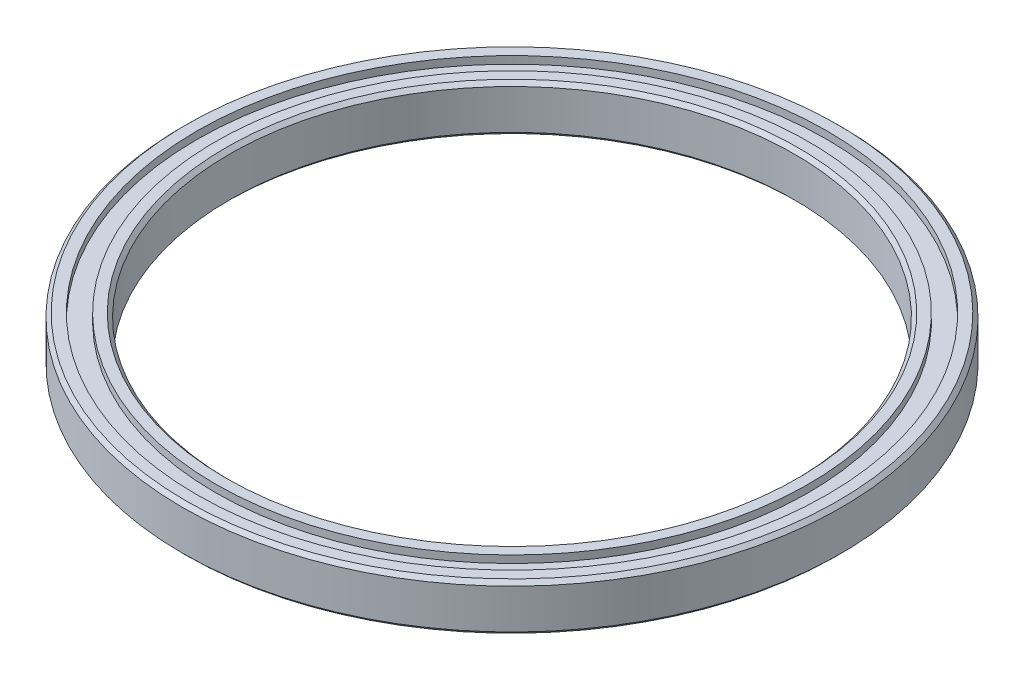
ISO-10303-21;
HEADER;
FILE_DESCRIPTION(('STEP AP214'),'2;1');
FILE_NAME('part.step','',(''),(''),'','','');
FILE_SCHEMA(('AUTOMOTIVE_DESIGN { 1 0 10303 214 1 1 1 1 }'));
ENDSEC;
DATA;
#1=APPLICATION_CONTEXT('core data for automotive mechanical design processes');
#2=APPLICATION_PROTOCOL_DEFINITION('international standard','automotive_design',2000,#1);
#3=PRODUCT_CONTEXT('',#1,'mechanical');
#4=PRODUCT('Part','Part','',(#3));
#5=PRODUCT_RELATED_PRODUCT_CATEGORY('part','',(#4));
#6=PRODUCT_DEFINITION_FORMATION('','',#4);
#7=PRODUCT_DEFINITION_CONTEXT('part definition',#1,'design');
#8=PRODUCT_DEFINITION('design','',#6,#7);
#9=PRODUCT_DEFINITION_SHAPE('','',#8);
#10=(LENGTH_UNIT() NAMED_UNIT(*) SI_UNIT(.MILLI.,.METRE.));
#11=(NAMED_UNIT(*) PLANE_ANGLE_UNIT() SI_UNIT($,.RADIAN.));
#12=(NAMED_UNIT(*) SI_UNIT($,.STERADIAN.) SOLID_ANGLE_UNIT());
#13=UNCERTAINTY_MEASURE_WITH_UNIT(LENGTH_MEASURE(1.E-05),#10,'distance_accuracy_value','');
#14=(GEOMETRIC_REPRESENTATION_CONTEXT(3) GLOBAL_UNCERTAINTY_ASSIGNED_CONTEXT((#13)) GLOBAL_UNIT_ASSIGNED_CONTEXT((#10,
#11,#12)) REPRESENTATION_CONTEXT('',''));
#15=CARTESIAN_POINT('',(0.,0.,0.));
#16=DIRECTION('',(0.,0.,1.));
#17=DIRECTION('',(1.,0.,0.));
#18=AXIS2_PLACEMENT_3D('',#15,#16,#17);
#19=CARTESIAN_POINT('',(0.,0.,0.));
#20=DIRECTION('',(0.,1.,0.));
#21=DIRECTION('',(0.,0.,1.));
#22=AXIS2_PLACEMENT_3D('',#19,#20,#21);
#23=PLANE('',#22);
#24=CARTESIAN_POINT('',(0.,0.,0.));
#25=DIRECTION('',(0.,1.,0.));
#26=DIRECTION('',(0.,0.,1.));
#27=AXIS2_PLACEMENT_3D('',#24,#25,#26);
#28=CIRCLE('',#27,38.6);
#29=CARTESIAN_POINT('',(0.,0.,38.6));
#30=VERTEX_POINT('',#29);
#31=EDGE_CURVE('E76',#30,#30,#28,.T.);
#32=ORIENTED_EDGE('',*,*,#31,.T.);
#33=EDGE_LOOP('',(#32));
#34=FACE_BOUND('',#33,.T.);
#35=CARTESIAN_POINT('',(0.,0.,0.));
#36=DIRECTION('',(0.,-1.,0.));
#37=DIRECTION('',(0.,0.,-1.));
#38=AXIS2_PLACEMENT_3D('',#35,#36,#37);
#39=CIRCLE('',#38,40.);
#40=CARTESIAN_POINT('',(0.,0.,-40.));
#41=VERTEX_POINT('',#40);
#42=EDGE_CURVE('E105',#41,#41,#39,.T.);
#43=ORIENTED_EDGE('',*,*,#42,.T.);
#44=EDGE_LOOP('',(#43));
#45=FACE_BOUND('',#44,.T.);
#46=ADVANCED_FACE('F39',(#34,#45),#23,.F.);
#47=CARTESIAN_POINT('',(0.,6.35,0.));
#48=DIRECTION('',(0.,1.,0.));
#49=DIRECTION('',(0.,0.,1.));
#50=AXIS2_PLACEMENT_3D('',#47,#48,#49);
#51=PLANE('',#50);
#52=CARTESIAN_POINT('',(0.,6.35,0.));
#53=DIRECTION('',(0.,1.,0.));
#54=DIRECTION('',(0.,0.,1.));
#55=AXIS2_PLACEMENT_3D('',#52,#53,#54);
#56=CIRCLE('',#55,38.6);
#57=CARTESIAN_POINT('',(0.,6.35,38.6));
#58=VERTEX_POINT('',#57);
#59=EDGE_CURVE('E64',#58,#58,#56,.F.);
#60=ORIENTED_EDGE('',*,*,#59,.T.);
#61=EDGE_LOOP('',(#60));
#62=FACE_BOUND('',#61,.T.);
#63=CARTESIAN_POINT('',(0.,6.35,0.));
#64=DIRECTION('',(0.,1.,0.));
#65=DIRECTION('',(0.,0.,1.));
#66=AXIS2_PLACEMENT_3D('',#63,#64,#65);
#67=CIRCLE('',#66,40.);
#68=CARTESIAN_POINT('',(0.,6.35,40.));
#69=VERTEX_POINT('',#68);
#70=EDGE_CURVE('E89',#69,#69,#67,.T.);
#71=ORIENTED_EDGE('',*,*,#70,.T.);
#72=EDGE_LOOP('',(#71));
#73=FACE_BOUND('',#72,.T.);
#74=ADVANCED_FACE('F140',(#62,#73),#51,.T.);
#75=CARTESIAN_POINT('',(0.,6.35,0.));
#76=DIRECTION('',(0.,1.,0.));
#77=DIRECTION('',(0.,0.,1.));
#78=AXIS2_PLACEMENT_3D('',#75,#76,#77);
#79=CIRCLE('',#78,43.95);
#80=CARTESIAN_POINT('',(0.,6.35,43.95));
#81=VERTEX_POINT('',#80);
#82=EDGE_CURVE('E58',#81,#81,#79,.T.);
#83=ORIENTED_EDGE('',*,*,#82,.T.);
#84=EDGE_LOOP('',(#83));
#85=FACE_BOUND('',#84,.T.);
#86=CARTESIAN_POINT('',(0.,6.35,0.));
#87=DIRECTION('',(0.,1.,0.));
#88=DIRECTION('',(0.,0.,1.));
#89=AXIS2_PLACEMENT_3D('',#86,#87,#88);
#90=CIRCLE('',#89,42.5);
#91=CARTESIAN_POINT('',(0.,6.35,42.5));
#92=VERTEX_POINT('',#91);
#93=EDGE_CURVE('E81',#92,#92,#90,.T.);
#94=ORIENTED_EDGE('',*,*,#93,.F.);
#95=EDGE_LOOP('',(#94));
#96=FACE_BOUND('',#95,.T.);
#97=ADVANCED_FACE('F132',(#85,#96),#51,.T.);
#98=CARTESIAN_POINT('',(0.,0.,0.));
#99=DIRECTION('',(0.,1.,0.));
#100=DIRECTION('',(0.,0.,1.));
#101=AXIS2_PLACEMENT_3D('',#98,#99,#100);
#102=CIRCLE('',#101,43.95);
#103=CARTESIAN_POINT('',(0.,0.,43.95));
#104=VERTEX_POINT('',#103);
#105=EDGE_CURVE('E10',#104,#104,#102,.F.);
#106=ORIENTED_EDGE('',*,*,#105,.T.);
#107=EDGE_LOOP('',(#106));
#108=FACE_BOUND('',#107,.T.);
#109=CARTESIAN_POINT('',(0.,0.,0.));
#110=DIRECTION('',(0.,-1.,0.));
#111=DIRECTION('',(0.,0.,-1.));
#112=AXIS2_PLACEMENT_3D('',#109,#110,#111);
#113=CIRCLE('',#112,42.5);
#114=CARTESIAN_POINT('',(0.,0.,-42.5));
#115=VERTEX_POINT('',#114);
#116=EDGE_CURVE('E97',#115,#115,#113,.T.);
#117=ORIENTED_EDGE('',*,*,#116,.F.);
#118=EDGE_LOOP('',(#117));
#119=FACE_BOUND('',#118,.T.);
#120=ADVANCED_FACE('F129',(#108,#119),#23,.F.);
#121=CARTESIAN_POINT('',(0.,6.35,0.));
#122=DIRECTION('',(0.,-1.,0.));
#123=DIRECTION('',(0.,0.,-1.));
#124=AXIS2_PLACEMENT_3D('',#121,#122,#123);
#125=CYLINDRICAL_SURFACE('',#124,44.45);
#126=CARTESIAN_POINT('',(0.,5.85000000000002,0.));
#127=DIRECTION('',(0.,1.,0.));
#128=DIRECTION('',(0.,0.,1.));
#129=AXIS2_PLACEMENT_3D('',#126,#127,#128);
#130=CIRCLE('',#129,44.45);
#131=CARTESIAN_POINT('',(0.,5.85000000000002,44.45));
#132=VERTEX_POINT('',#131);
#133=EDGE_CURVE('E48',#132,#132,#130,.F.);
#134=ORIENTED_EDGE('',*,*,#133,.T.);
#135=EDGE_LOOP('',(#134));
#136=FACE_BOUND('',#135,.T.);
#137=CARTESIAN_POINT('',(0.,0.500000000000007,0.));
#138=DIRECTION('',(0.,1.,0.));
#139=DIRECTION('',(0.,0.,1.));
#140=AXIS2_PLACEMENT_3D('',#137,#138,#139);
#141=CIRCLE('',#140,44.45);
#142=CARTESIAN_POINT('',(0.,0.500000000000007,44.45));
#143=VERTEX_POINT('',#142);
#144=EDGE_CURVE('E53',#143,#143,#141,.T.);
#145=ORIENTED_EDGE('',*,*,#144,.T.);
#146=EDGE_LOOP('',(#145));
#147=FACE_BOUND('',#146,.T.);
#148=ADVANCED_FACE('F131',(#136,#147),#125,.T.);
#149=CARTESIAN_POINT('',(0.,6.35,0.));
#150=DIRECTION('',(0.,-1.,0.));
#151=DIRECTION('',(0.,0.,-1.));
#152=AXIS2_PLACEMENT_3D('',#149,#150,#151);
#153=CYLINDRICAL_SURFACE('',#152,38.1);
#154=CARTESIAN_POINT('',(0.,0.499999999999987,0.));
#155=DIRECTION('',(0.,1.,0.));
#156=DIRECTION('',(0.,0.,1.));
#157=AXIS2_PLACEMENT_3D('',#154,#155,#156);
#158=CIRCLE('',#157,38.1);
#159=CARTESIAN_POINT('',(0.,0.499999999999987,38.1));
#160=VERTEX_POINT('',#159);
#161=EDGE_CURVE('E68',#160,#160,#158,.F.);
#162=ORIENTED_EDGE('',*,*,#161,.T.);
#163=EDGE_LOOP('',(#162));
#164=FACE_BOUND('',#163,.T.);
#165=CARTESIAN_POINT('',(0.,5.84999999999998,0.));
#166=DIRECTION('',(0.,1.,0.));
#167=DIRECTION('',(0.,0.,1.));
#168=AXIS2_PLACEMENT_3D('',#165,#166,#167);
#169=CIRCLE('',#168,38.1);
#170=CARTESIAN_POINT('',(0.,5.84999999999998,38.1));
#171=VERTEX_POINT('',#170);
#172=EDGE_CURVE('E72',#171,#171,#169,.T.);
#173=ORIENTED_EDGE('',*,*,#172,.T.);
#174=EDGE_LOOP('',(#173));
#175=FACE_BOUND('',#174,.T.);
#176=ADVANCED_FACE('F138',(#164,#175),#153,.F.);
#177=CARTESIAN_POINT('',(0.,5.35,0.));
#178=DIRECTION('',(0.,1.,0.));
#179=DIRECTION('',(0.,0.,1.));
#180=AXIS2_PLACEMENT_3D('',#177,#178,#179);
#181=CYLINDRICAL_SURFACE('',#180,42.5);
#182=CARTESIAN_POINT('',(0.,5.35,0.));
#183=DIRECTION('',(0.,1.,0.));
#184=DIRECTION('',(0.,0.,1.));
#185=AXIS2_PLACEMENT_3D('',#182,#183,#184);
#186=CIRCLE('',#185,42.5);
#187=CARTESIAN_POINT('',(0.,5.35,42.5));
#188=VERTEX_POINT('',#187);
#189=EDGE_CURVE('E80',#188,#188,#186,.T.);
#190=ORIENTED_EDGE('',*,*,#189,.F.);
#191=EDGE_LOOP('',(#190));
#192=FACE_BOUND('',#191,.T.);
#193=ORIENTED_EDGE('',*,*,#93,.T.);
#194=EDGE_LOOP('',(#193));
#195=FACE_BOUND('',#194,.T.);
#196=ADVANCED_FACE('F168',(#192,#195),#181,.F.);
#197=CARTESIAN_POINT('',(0.,5.35,0.));
#198=DIRECTION('',(0.,1.,0.));
#199=DIRECTION('',(0.,0.,1.));
#200=AXIS2_PLACEMENT_3D('',#197,#198,#199);
#201=PLANE('',#200);
#202=CARTESIAN_POINT('',(0.,5.35,0.));
#203=DIRECTION('',(0.,1.,0.));
#204=DIRECTION('',(0.,0.,1.));
#205=AXIS2_PLACEMENT_3D('',#202,#203,#204);
#206=CIRCLE('',#205,40.);
#207=CARTESIAN_POINT('',(0.,5.35,40.));
#208=VERTEX_POINT('',#207);
#209=EDGE_CURVE('E85',#208,#208,#206,.T.);
#210=ORIENTED_EDGE('',*,*,#209,.F.);
#211=EDGE_LOOP('',(#210));
#212=FACE_BOUND('',#211,.T.);
#213=ORIENTED_EDGE('',*,*,#189,.T.);
#214=EDGE_LOOP('',(#213));
#215=FACE_BOUND('',#214,.T.);
#216=ADVANCED_FACE('F164',(#212,#215),#201,.T.);
#217=CARTESIAN_POINT('',(0.,5.35,0.));
#218=DIRECTION('',(0.,1.,0.));
#219=DIRECTION('',(0.,0.,1.));
#220=AXIS2_PLACEMENT_3D('',#217,#218,#219);
#221=CYLINDRICAL_SURFACE('',#220,40.);
#222=ORIENTED_EDGE('',*,*,#209,.T.);
#223=EDGE_LOOP('',(#222));
#224=FACE_BOUND('',#223,.T.);
#225=ORIENTED_EDGE('',*,*,#70,.F.);
#226=EDGE_LOOP('',(#225));
#227=FACE_BOUND('',#226,.T.);
#228=ADVANCED_FACE('F125',(#224,#227),#221,.T.);
#229=CARTESIAN_POINT('',(0.,1.,0.));
#230=DIRECTION('',(0.,-1.,0.));
#231=DIRECTION('',(0.,0.,-1.));
#232=AXIS2_PLACEMENT_3D('',#229,#230,#231);
#233=CYLINDRICAL_SURFACE('',#232,42.5);
#234=CARTESIAN_POINT('',(0.,1.,0.));
#235=DIRECTION('',(0.,-1.,0.));
#236=DIRECTION('',(0.,0.,-1.));
#237=AXIS2_PLACEMENT_3D('',#234,#235,#236);
#238=CIRCLE('',#237,42.5);
#239=CARTESIAN_POINT('',(0.,1.,-42.5));
#240=VERTEX_POINT('',#239);
#241=EDGE_CURVE('E93',#240,#240,#238,.T.);
#242=ORIENTED_EDGE('',*,*,#241,.F.);
#243=EDGE_LOOP('',(#242));
#244=FACE_BOUND('',#243,.T.);
#245=ORIENTED_EDGE('',*,*,#116,.T.);
#246=EDGE_LOOP('',(#245));
#247=FACE_BOUND('',#246,.T.);
#248=ADVANCED_FACE('F119',(#244,#247),#233,.F.);
#249=CARTESIAN_POINT('',(0.,1.,0.));
#250=DIRECTION('',(0.,-1.,0.));
#251=DIRECTION('',(0.,0.,-1.));
#252=AXIS2_PLACEMENT_3D('',#249,#250,#251);
#253=PLANE('',#252);
#254=CARTESIAN_POINT('',(0.,1.,0.));
#255=DIRECTION('',(0.,-1.,0.));
#256=DIRECTION('',(0.,0.,-1.));
#257=AXIS2_PLACEMENT_3D('',#254,#255,#256);
#258=CIRCLE('',#257,40.);
#259=CARTESIAN_POINT('',(0.,1.,-40.));
#260=VERTEX_POINT('',#259);
#261=EDGE_CURVE('E101',#260,#260,#258,.T.);
#262=ORIENTED_EDGE('',*,*,#261,.F.);
#263=EDGE_LOOP('',(#262));
#264=FACE_BOUND('',#263,.T.);
#265=ORIENTED_EDGE('',*,*,#241,.T.);
#266=EDGE_LOOP('',(#265));
#267=FACE_BOUND('',#266,.T.);
#268=ADVANCED_FACE('F116',(#264,#267),#253,.T.);
#269=CARTESIAN_POINT('',(0.,1.,0.));
#270=DIRECTION('',(0.,-1.,0.));
#271=DIRECTION('',(0.,0.,-1.));
#272=AXIS2_PLACEMENT_3D('',#269,#270,#271);
#273=CYLINDRICAL_SURFACE('',#272,40.);
#274=ORIENTED_EDGE('',*,*,#261,.T.);
#275=EDGE_LOOP('',(#274));
#276=FACE_BOUND('',#275,.T.);
#277=ORIENTED_EDGE('',*,*,#42,.F.);
#278=EDGE_LOOP('',(#277));
#279=FACE_BOUND('',#278,.T.);
#280=ADVANCED_FACE('F113',(#276,#279),#273,.T.);
#281=CARTESIAN_POINT('',(0.,0.,0.));
#282=DIRECTION('',(0.,-1.,0.));
#283=DIRECTION('',(0.,0.,-1.));
#284=AXIS2_PLACEMENT_3D('',#281,#282,#283);
#285=CONICAL_SURFACE('',#284,38.6,0.785398163397448);
#286=ORIENTED_EDGE('',*,*,#161,.F.);
#287=EDGE_LOOP('',(#286));
#288=FACE_BOUND('',#287,.T.);
#289=ORIENTED_EDGE('',*,*,#31,.F.);
#290=EDGE_LOOP('',(#289));
#291=FACE_BOUND('',#290,.T.);
#292=ADVANCED_FACE('F153',(#288,#291),#285,.F.);
#293=CARTESIAN_POINT('',(0.,5.84999999999998,0.));
#294=DIRECTION('',(0.,1.,0.));
#295=DIRECTION('',(0.,0.,1.));
#296=AXIS2_PLACEMENT_3D('',#293,#294,#295);
#297=CONICAL_SURFACE('',#296,38.1,0.785398163397462);
#298=ORIENTED_EDGE('',*,*,#59,.F.);
#299=EDGE_LOOP('',(#298));
#300=FACE_BOUND('',#299,.T.);
#301=ORIENTED_EDGE('',*,*,#172,.F.);
#302=EDGE_LOOP('',(#301));
#303=FACE_BOUND('',#302,.T.);
#304=ADVANCED_FACE('F158',(#300,#303),#297,.F.);
#305=CARTESIAN_POINT('',(0.,6.35,0.));
#306=DIRECTION('',(0.,-1.,0.));
#307=DIRECTION('',(0.,0.,-1.));
#308=AXIS2_PLACEMENT_3D('',#305,#306,#307);
#309=CONICAL_SURFACE('',#308,43.95,0.785398163397434);
#310=ORIENTED_EDGE('',*,*,#133,.F.);
#311=EDGE_LOOP('',(#310));
#312=FACE_BOUND('',#311,.T.);
#313=ORIENTED_EDGE('',*,*,#82,.F.);
#314=EDGE_LOOP('',(#313));
#315=FACE_BOUND('',#314,.T.);
#316=ADVANCED_FACE('F182',(#312,#315),#309,.T.);
#317=CARTESIAN_POINT('',(0.,0.500000000000007,0.));
#318=DIRECTION('',(0.,1.,0.));
#319=DIRECTION('',(0.,0.,1.));
#320=AXIS2_PLACEMENT_3D('',#317,#318,#319);
#321=CONICAL_SURFACE('',#320,44.45,0.785398163397455);
#322=ORIENTED_EDGE('',*,*,#105,.F.);
#323=EDGE_LOOP('',(#322));
#324=FACE_BOUND('',#323,.T.);
#325=ORIENTED_EDGE('',*,*,#144,.F.);
#326=EDGE_LOOP('',(#325));
#327=FACE_BOUND('',#326,.T.);
#328=ADVANCED_FACE('F42',(#324,#327),#321,.T.);
#329=CLOSED_SHELL('',(#46,#74,#97,#120,#148,#176,#196,#216,#228,#248,#268,#280,#292,#304,#316,#328));
#330=MANIFOLD_SOLID_BREP('B2',#329);
#331=ADVANCED_BREP_SHAPE_REPRESENTATION('',(#18,#330),#14);
#332=SHAPE_DEFINITION_REPRESENTATION(#9,#331);
ENDSEC;
END-ISO-10303-21;
